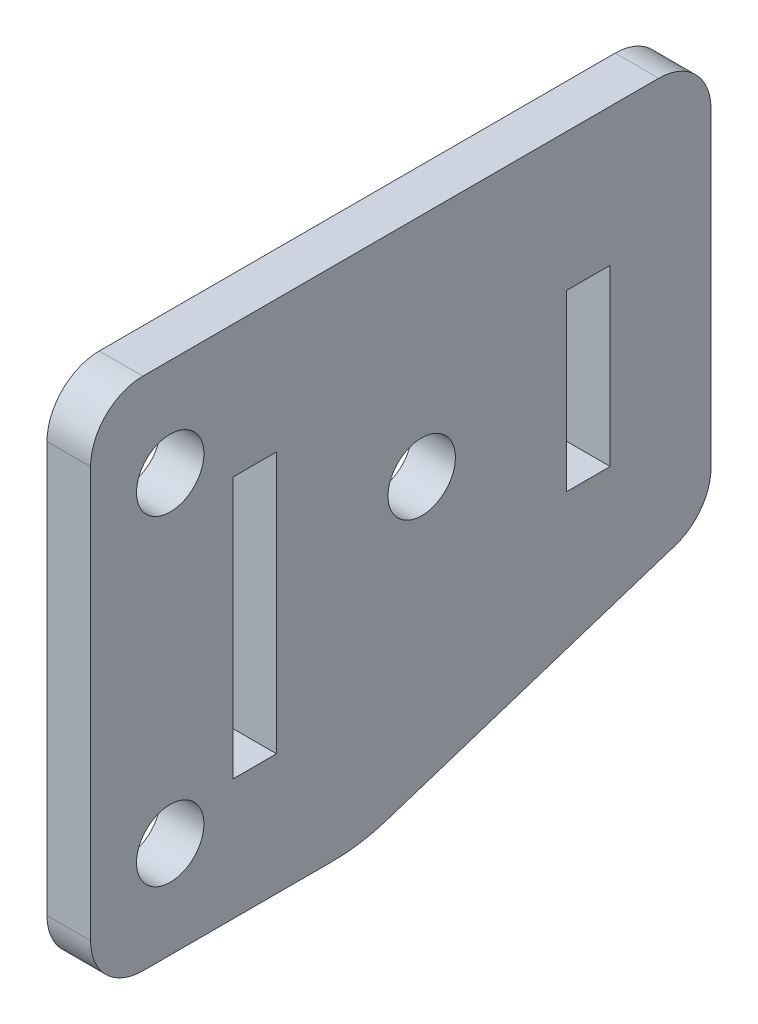
ISO-10303-21;
HEADER;
FILE_DESCRIPTION(('STEP AP214'),'2;1');
FILE_NAME('part.step','',(''),(''),'','','');
FILE_SCHEMA(('AUTOMOTIVE_DESIGN { 1 0 10303 214 1 1 1 1 }'));
ENDSEC;
DATA;
#1=APPLICATION_CONTEXT('core data for automotive mechanical design processes');
#2=APPLICATION_PROTOCOL_DEFINITION('international standard','automotive_design',2000,#1);
#3=PRODUCT_CONTEXT('',#1,'mechanical');
#4=PRODUCT('Part','Part','',(#3));
#5=PRODUCT_RELATED_PRODUCT_CATEGORY('part','',(#4));
#6=PRODUCT_DEFINITION_FORMATION('','',#4);
#7=PRODUCT_DEFINITION_CONTEXT('part definition',#1,'design');
#8=PRODUCT_DEFINITION('design','',#6,#7);
#9=PRODUCT_DEFINITION_SHAPE('','',#8);
#10=(LENGTH_UNIT() NAMED_UNIT(*) SI_UNIT(.MILLI.,.METRE.));
#11=(NAMED_UNIT(*) PLANE_ANGLE_UNIT() SI_UNIT($,.RADIAN.));
#12=(NAMED_UNIT(*) SI_UNIT($,.STERADIAN.) SOLID_ANGLE_UNIT());
#13=UNCERTAINTY_MEASURE_WITH_UNIT(LENGTH_MEASURE(1.E-05),#10,'distance_accuracy_value','');
#14=(GEOMETRIC_REPRESENTATION_CONTEXT(3) GLOBAL_UNCERTAINTY_ASSIGNED_CONTEXT((#13)) GLOBAL_UNIT_ASSIGNED_CONTEXT((#10,
#11,#12)) REPRESENTATION_CONTEXT('',''));
#15=CARTESIAN_POINT('',(0.,0.,0.));
#16=DIRECTION('',(0.,0.,1.));
#17=DIRECTION('',(1.,0.,0.));
#18=AXIS2_PLACEMENT_3D('',#15,#16,#17);
#19=CARTESIAN_POINT('',(-3.175,25.4,56.642));
#20=DIRECTION('',(0.,0.,1.));
#21=DIRECTION('',(1.,0.,0.));
#22=AXIS2_PLACEMENT_3D('',#19,#20,#21);
#23=PLANE('',#22);
#24=DIRECTION('',(0.,-1.,0.));
#25=VECTOR('',#24,1.);
#26=CARTESIAN_POINT('',(0.,25.4,56.642));
#27=LINE('',#26,#25);
#28=CARTESIAN_POINT('',(0.,21.59,56.642));
#29=VERTEX_POINT('',#28);
#30=CARTESIAN_POINT('',(0.,-8.32104000000001,56.642));
#31=VERTEX_POINT('',#30);
#32=EDGE_CURVE('E257',#29,#31,#27,.T.);
#33=ORIENTED_EDGE('',*,*,#32,.F.);
#34=DIRECTION('',(1.,0.,0.));
#35=VECTOR('',#34,1.);
#36=CARTESIAN_POINT('',(-3.175,21.59,56.642));
#37=LINE('',#36,#35);
#38=CARTESIAN_POINT('',(-3.175,21.59,56.642));
#39=VERTEX_POINT('',#38);
#40=EDGE_CURVE('E41',#29,#39,#37,.F.);
#41=ORIENTED_EDGE('',*,*,#40,.T.);
#42=DIRECTION('',(0.,-1.,0.));
#43=VECTOR('',#42,1.);
#44=CARTESIAN_POINT('',(-3.175,25.4,56.642));
#45=LINE('',#44,#43);
#46=CARTESIAN_POINT('',(-3.175,-8.32104000000001,56.642));
#47=VERTEX_POINT('',#46);
#48=EDGE_CURVE('E268',#39,#47,#45,.T.);
#49=ORIENTED_EDGE('',*,*,#48,.T.);
#50=DIRECTION('',(1.,0.,0.));
#51=VECTOR('',#50,1.);
#52=CARTESIAN_POINT('',(-3.175,-8.32104000000001,56.642));
#53=LINE('',#52,#51);
#54=EDGE_CURVE('E317',#47,#31,#53,.T.);
#55=ORIENTED_EDGE('',*,*,#54,.T.);
#56=EDGE_LOOP('',(#33,#41,#49,#55));
#57=FACE_BOUND('',#56,.T.);
#58=ADVANCED_FACE('F33',(#57),#23,.T.);
#59=CARTESIAN_POINT('',(-3.175,25.4,11.43));
#60=DIRECTION('',(0.,1.,0.));
#61=DIRECTION('',(0.,0.,1.));
#62=AXIS2_PLACEMENT_3D('',#59,#60,#61);
#63=PLANE('',#62);
#64=DIRECTION('',(0.,0.,1.));
#65=VECTOR('',#64,1.);
#66=CARTESIAN_POINT('',(0.,25.4,11.43));
#67=LINE('',#66,#65);
#68=CARTESIAN_POINT('',(0.,25.4,15.24));
#69=VERTEX_POINT('',#68);
#70=CARTESIAN_POINT('',(0.,25.4,52.832));
#71=VERTEX_POINT('',#70);
#72=EDGE_CURVE('E281',#69,#71,#67,.T.);
#73=ORIENTED_EDGE('',*,*,#72,.F.);
#74=DIRECTION('',(1.,0.,0.));
#75=VECTOR('',#74,1.);
#76=CARTESIAN_POINT('',(-3.175,25.4,15.24));
#77=LINE('',#76,#75);
#78=CARTESIAN_POINT('',(-3.175,25.4,15.24));
#79=VERTEX_POINT('',#78);
#80=EDGE_CURVE('E306',#69,#79,#77,.F.);
#81=ORIENTED_EDGE('',*,*,#80,.T.);
#82=DIRECTION('',(0.,0.,1.));
#83=VECTOR('',#82,1.);
#84=CARTESIAN_POINT('',(-3.175,25.4,11.43));
#85=LINE('',#84,#83);
#86=CARTESIAN_POINT('',(-3.175,25.4,52.832));
#87=VERTEX_POINT('',#86);
#88=EDGE_CURVE('E265',#79,#87,#85,.T.);
#89=ORIENTED_EDGE('',*,*,#88,.T.);
#90=DIRECTION('',(1.,0.,0.));
#91=VECTOR('',#90,1.);
#92=CARTESIAN_POINT('',(-3.175,25.4,52.832));
#93=LINE('',#92,#91);
#94=EDGE_CURVE('E303',#87,#71,#93,.T.);
#95=ORIENTED_EDGE('',*,*,#94,.T.);
#96=EDGE_LOOP('',(#73,#81,#89,#95));
#97=FACE_BOUND('',#96,.T.);
#98=ADVANCED_FACE('F331',(#97),#63,.T.);
#99=CARTESIAN_POINT('',(-3.175,-3.83383616291751,11.43));
#100=DIRECTION('',(0.,0.,-1.));
#101=DIRECTION('',(-1.,0.,0.));
#102=AXIS2_PLACEMENT_3D('',#99,#100,#101);
#103=PLANE('',#102);
#104=DIRECTION('',(0.,1.,0.));
#105=VECTOR('',#104,1.);
#106=CARTESIAN_POINT('',(-3.175,-3.83383616291751,11.43));
#107=LINE('',#106,#105);
#108=CARTESIAN_POINT('',(-3.175,-1.06497014433907,11.43));
#109=VERTEX_POINT('',#108);
#110=CARTESIAN_POINT('',(-3.175,21.59,11.43));
#111=VERTEX_POINT('',#110);
#112=EDGE_CURVE('E262',#109,#111,#107,.T.);
#113=ORIENTED_EDGE('',*,*,#112,.T.);
#114=DIRECTION('',(1.,0.,0.));
#115=VECTOR('',#114,1.);
#116=CARTESIAN_POINT('',(-3.175,21.59,11.43));
#117=LINE('',#116,#115);
#118=CARTESIAN_POINT('',(0.,21.59,11.43));
#119=VERTEX_POINT('',#118);
#120=EDGE_CURVE('E292',#111,#119,#117,.T.);
#121=ORIENTED_EDGE('',*,*,#120,.T.);
#122=DIRECTION('',(0.,1.,0.));
#123=VECTOR('',#122,1.);
#124=CARTESIAN_POINT('',(0.,-3.83383616291751,11.43));
#125=LINE('',#124,#123);
#126=CARTESIAN_POINT('',(0.,-1.06497014433907,11.43));
#127=VERTEX_POINT('',#126);
#128=EDGE_CURVE('E278',#127,#119,#125,.T.);
#129=ORIENTED_EDGE('',*,*,#128,.F.);
#130=DIRECTION('',(1.,0.,0.));
#131=VECTOR('',#130,1.);
#132=CARTESIAN_POINT('',(-3.175,-1.06497014433907,11.43));
#133=LINE('',#132,#131);
#134=EDGE_CURVE('E288',#127,#109,#133,.F.);
#135=ORIENTED_EDGE('',*,*,#134,.T.);
#136=EDGE_LOOP('',(#113,#121,#129,#135));
#137=FACE_BOUND('',#136,.T.);
#138=ADVANCED_FACE('F340',(#137),#103,.T.);
#139=CARTESIAN_POINT('',(-3.175,-11.5104536973722,35.0766243864602));
#140=DIRECTION('',(0.,-0.95113493680096,-0.308775536590309));
#141=DIRECTION('',(0.,0.308775536590309,-0.951134936800961));
#142=AXIS2_PLACEMENT_3D('',#139,#140,#141);
#143=PLANE('',#142);
#144=DIRECTION('',(0.,0.308775536590309,-0.95113493680096));
#145=VECTOR('',#144,1.);
#146=CARTESIAN_POINT('',(-3.175,-11.5104536973722,35.0766243864602));
#147=LINE('',#146,#145);
#148=CARTESIAN_POINT('',(-3.175,-11.5104536973722,35.0766243864602));
#149=VERTEX_POINT('',#148);
#150=CARTESIAN_POINT('',(-3.175,-4.68879425355073,14.0635652055909));
#151=VERTEX_POINT('',#150);
#152=EDGE_CURVE('E260',#149,#151,#147,.T.);
#153=ORIENTED_EDGE('',*,*,#152,.T.);
#154=DIRECTION('',(1.,0.,0.));
#155=VECTOR('',#154,1.);
#156=CARTESIAN_POINT('',(-3.175,-4.68879425355073,14.0635652055909));
#157=LINE('',#156,#155);
#158=CARTESIAN_POINT('',(0.,-4.68879425355073,14.0635652055909));
#159=VERTEX_POINT('',#158);
#160=EDGE_CURVE('E314',#151,#159,#157,.T.);
#161=ORIENTED_EDGE('',*,*,#160,.T.);
#162=DIRECTION('',(0.,0.308775536590309,-0.95113493680096));
#163=VECTOR('',#162,1.);
#164=CARTESIAN_POINT('',(0.,-11.5104536973722,35.0766243864602));
#165=LINE('',#164,#163);
#166=CARTESIAN_POINT('',(0.,-11.5104536973722,35.0766243864602));
#167=VERTEX_POINT('',#166);
#168=EDGE_CURVE('E275',#167,#159,#165,.T.);
#169=ORIENTED_EDGE('',*,*,#168,.F.);
#170=DIRECTION('',(1.,0.,0.));
#171=VECTOR('',#170,1.);
#172=CARTESIAN_POINT('',(-3.175,-11.5104536973722,35.0766243864602));
#173=LINE('',#172,#171);
#174=EDGE_CURVE('E286',#149,#167,#173,.T.);
#175=ORIENTED_EDGE('',*,*,#174,.F.);
#176=EDGE_LOOP('',(#153,#161,#169,#175));
#177=FACE_BOUND('',#176,.T.);
#178=ADVANCED_FACE('F347',(#177),#143,.T.);
#179=CARTESIAN_POINT('',(-3.175,0.56895999999998,38.9980737011571));
#180=DIRECTION('',(1.,0.,0.));
#181=DIRECTION('',(0.,0.,-1.));
#182=AXIS2_PLACEMENT_3D('',#179,#180,#181);
#183=CYLINDRICAL_SURFACE('',#182,12.7);
#184=CARTESIAN_POINT('',(0.,0.56895999999998,38.9980737011571));
#185=DIRECTION('',(1.,0.,0.));
#186=DIRECTION('',(0.,0.,-1.));
#187=AXIS2_PLACEMENT_3D('',#184,#185,#186);
#188=CIRCLE('',#187,12.7);
#189=CARTESIAN_POINT('',(0.,-12.13104,38.9980737011571));
#190=VERTEX_POINT('',#189);
#191=EDGE_CURVE('E272',#190,#167,#188,.T.);
#192=ORIENTED_EDGE('',*,*,#191,.F.);
#193=DIRECTION('',(1.,0.,0.));
#194=VECTOR('',#193,1.);
#195=CARTESIAN_POINT('',(-3.175,-12.13104,38.9980737011571));
#196=LINE('',#195,#194);
#197=CARTESIAN_POINT('',(-3.175,-12.13104,38.9980737011571));
#198=VERTEX_POINT('',#197);
#199=EDGE_CURVE('E270',#198,#190,#196,.T.);
#200=ORIENTED_EDGE('',*,*,#199,.F.);
#201=CARTESIAN_POINT('',(-3.175,0.56895999999998,38.9980737011571));
#202=DIRECTION('',(1.,0.,0.));
#203=DIRECTION('',(0.,0.,-1.));
#204=AXIS2_PLACEMENT_3D('',#201,#202,#203);
#205=CIRCLE('',#204,12.7);
#206=EDGE_CURVE('E256',#198,#149,#205,.T.);
#207=ORIENTED_EDGE('',*,*,#206,.T.);
#208=ORIENTED_EDGE('',*,*,#174,.T.);
#209=EDGE_LOOP('',(#192,#200,#207,#208));
#210=FACE_BOUND('',#209,.T.);
#211=ADVANCED_FACE('F352',(#210),#183,.T.);
#212=CARTESIAN_POINT('',(-3.175,-12.13104,38.9980737011571));
#213=DIRECTION('',(0.,-1.,0.));
#214=DIRECTION('',(0.,0.,-1.));
#215=AXIS2_PLACEMENT_3D('',#212,#213,#214);
#216=PLANE('',#215);
#217=DIRECTION('',(0.,0.,-1.));
#218=VECTOR('',#217,1.);
#219=CARTESIAN_POINT('',(0.,-12.13104,38.9980737011571));
#220=LINE('',#219,#218);
#221=CARTESIAN_POINT('',(0.,-12.13104,52.832));
#222=VERTEX_POINT('',#221);
#223=EDGE_CURVE('E253',#222,#190,#220,.T.);
#224=ORIENTED_EDGE('',*,*,#223,.F.);
#225=DIRECTION('',(1.,0.,0.));
#226=VECTOR('',#225,1.);
#227=CARTESIAN_POINT('',(-3.175,-12.13104,52.832));
#228=LINE('',#227,#226);
#229=CARTESIAN_POINT('',(-3.175,-12.13104,52.832));
#230=VERTEX_POINT('',#229);
#231=EDGE_CURVE('E11',#222,#230,#228,.F.);
#232=ORIENTED_EDGE('',*,*,#231,.T.);
#233=DIRECTION('',(0.,0.,-1.));
#234=VECTOR('',#233,1.);
#235=CARTESIAN_POINT('',(-3.175,-12.13104,39.2034693834696));
#236=LINE('',#235,#234);
#237=EDGE_CURVE('E254',#230,#198,#236,.T.);
#238=ORIENTED_EDGE('',*,*,#237,.T.);
#239=ORIENTED_EDGE('',*,*,#199,.T.);
#240=EDGE_LOOP('',(#224,#232,#238,#239));
#241=FACE_BOUND('',#240,.T.);
#242=ADVANCED_FACE('F357',(#241),#216,.T.);
#243=CARTESIAN_POINT('',(-3.175,0.56895999999998,38.9980737011571));
#244=DIRECTION('',(1.,0.,0.));
#245=DIRECTION('',(0.,0.,-1.));
#246=AXIS2_PLACEMENT_3D('',#243,#244,#245);
#247=PLANE('',#246);
#248=DIRECTION('',(0.,-1.,0.));
#249=VECTOR('',#248,1.);
#250=CARTESIAN_POINT('',(-3.175,-3.30200000000007,43.0911));
#251=LINE('',#250,#249);
#252=CARTESIAN_POINT('',(-3.175,15.7479999999999,43.0911));
#253=VERTEX_POINT('',#252);
#254=CARTESIAN_POINT('',(-3.175,-3.30200000000007,43.0911));
#255=VERTEX_POINT('',#254);
#256=EDGE_CURVE('E194',#253,#255,#251,.T.);
#257=ORIENTED_EDGE('',*,*,#256,.F.);
#258=DIRECTION('',(0.,0.,-1.));
#259=VECTOR('',#258,1.);
#260=CARTESIAN_POINT('',(-3.175,15.7479999999999,43.0911));
#261=LINE('',#260,#259);
#262=CARTESIAN_POINT('',(-3.175,15.7479999999999,46.2661));
#263=VERTEX_POINT('',#262);
#264=EDGE_CURVE('E167',#263,#253,#261,.T.);
#265=ORIENTED_EDGE('',*,*,#264,.F.);
#266=DIRECTION('',(0.,1.,0.));
#267=VECTOR('',#266,1.);
#268=CARTESIAN_POINT('',(-3.175,15.7479999999999,46.2661));
#269=LINE('',#268,#267);
#270=CARTESIAN_POINT('',(-3.175,-3.30200000000007,46.2661));
#271=VERTEX_POINT('',#270);
#272=EDGE_CURVE('E185',#271,#263,#269,.T.);
#273=ORIENTED_EDGE('',*,*,#272,.F.);
#274=DIRECTION('',(0.,0.,1.));
#275=VECTOR('',#274,1.);
#276=CARTESIAN_POINT('',(-3.175,-3.30200000000007,46.2661));
#277=LINE('',#276,#275);
#278=EDGE_CURVE('E188',#255,#271,#277,.T.);
#279=ORIENTED_EDGE('',*,*,#278,.F.);
#280=EDGE_LOOP('',(#257,#265,#273,#279));
#281=FACE_BOUND('',#280,.T.);
#282=DIRECTION('',(0.,0.,-1.));
#283=VECTOR('',#282,1.);
#284=CARTESIAN_POINT('',(-3.175,15.3709938714929,21.9521444970417));
#285=LINE('',#284,#283);
#286=CARTESIAN_POINT('',(-3.175,15.3709938714929,21.9521444970417));
#287=VERTEX_POINT('',#286);
#288=CARTESIAN_POINT('',(-3.175,15.3709938714929,18.7771444970417));
#289=VERTEX_POINT('',#288);
#290=EDGE_CURVE('E221',#287,#289,#285,.T.);
#291=ORIENTED_EDGE('',*,*,#290,.F.);
#292=DIRECTION('',(0.,1.,0.));
#293=VECTOR('',#292,1.);
#294=CARTESIAN_POINT('',(-3.175,2.67099387149287,21.9521444970417));
#295=LINE('',#294,#293);
#296=CARTESIAN_POINT('',(-3.175,2.67099387149287,21.9521444970417));
#297=VERTEX_POINT('',#296);
#298=EDGE_CURVE('E219',#297,#287,#295,.T.);
#299=ORIENTED_EDGE('',*,*,#298,.F.);
#300=DIRECTION('',(0.,0.,1.));
#301=VECTOR('',#300,1.);
#302=CARTESIAN_POINT('',(-3.175,2.67099387149287,18.7771444970417));
#303=LINE('',#302,#301);
#304=CARTESIAN_POINT('',(-3.175,2.67099387149287,18.7771444970417));
#305=VERTEX_POINT('',#304);
#306=EDGE_CURVE('E209',#305,#297,#303,.T.);
#307=ORIENTED_EDGE('',*,*,#306,.F.);
#308=DIRECTION('',(0.,-1.,0.));
#309=VECTOR('',#308,1.);
#310=CARTESIAN_POINT('',(-3.175,15.3709938714929,18.7771444970417));
#311=LINE('',#310,#309);
#312=EDGE_CURVE('E224',#289,#305,#311,.T.);
#313=ORIENTED_EDGE('',*,*,#312,.F.);
#314=EDGE_LOOP('',(#291,#299,#307,#313));
#315=FACE_BOUND('',#314,.T.);
#316=CARTESIAN_POINT('',(-3.175,-5.08,50.8381));
#317=DIRECTION('',(1.,0.,0.));
#318=DIRECTION('',(0.,0.,-1.));
#319=AXIS2_PLACEMENT_3D('',#316,#317,#318);
#320=CIRCLE('',#319,2.45744999999999);
#321=CARTESIAN_POINT('',(-3.175,-5.08,48.38065));
#322=VERTEX_POINT('',#321);
#323=EDGE_CURVE('E238',#322,#322,#320,.T.);
#324=ORIENTED_EDGE('',*,*,#323,.T.);
#325=EDGE_LOOP('',(#324));
#326=FACE_BOUND('',#325,.T.);
#327=CARTESIAN_POINT('',(-3.175,18.288,50.8381));
#328=DIRECTION('',(1.,0.,0.));
#329=DIRECTION('',(0.,0.,-1.));
#330=AXIS2_PLACEMENT_3D('',#327,#328,#329);
#331=CIRCLE('',#330,2.45744999999999);
#332=CARTESIAN_POINT('',(-3.175,18.288,48.38065));
#333=VERTEX_POINT('',#332);
#334=EDGE_CURVE('E244',#333,#333,#331,.T.);
#335=ORIENTED_EDGE('',*,*,#334,.T.);
#336=EDGE_LOOP('',(#335));
#337=FACE_BOUND('',#336,.T.);
#338=CARTESIAN_POINT('',(-3.175,8.89,32.5120000000061));
#339=DIRECTION('',(1.,0.,0.));
#340=DIRECTION('',(0.,0.,-1.));
#341=AXIS2_PLACEMENT_3D('',#338,#339,#340);
#342=CIRCLE('',#341,2.45744999999999);
#343=CARTESIAN_POINT('',(-3.175,8.89,30.0545500000061));
#344=VERTEX_POINT('',#343);
#345=EDGE_CURVE('E250',#344,#344,#342,.T.);
#346=ORIENTED_EDGE('',*,*,#345,.T.);
#347=EDGE_LOOP('',(#346));
#348=FACE_BOUND('',#347,.T.);
#349=ORIENTED_EDGE('',*,*,#88,.F.);
#350=CARTESIAN_POINT('',(-3.175,21.59,15.24));
#351=DIRECTION('',(1.,0.,0.));
#352=DIRECTION('',(0.,0.,-1.));
#353=AXIS2_PLACEMENT_3D('',#350,#351,#352);
#354=CIRCLE('',#353,3.81);
#355=EDGE_CURVE('E312',#79,#111,#354,.F.);
#356=ORIENTED_EDGE('',*,*,#355,.T.);
#357=ORIENTED_EDGE('',*,*,#112,.F.);
#358=CARTESIAN_POINT('',(-3.175,-1.06497014433907,15.24));
#359=DIRECTION('',(1.,0.,0.));
#360=DIRECTION('',(0.,0.,-1.));
#361=AXIS2_PLACEMENT_3D('',#358,#359,#360);
#362=CIRCLE('',#361,3.81);
#363=EDGE_CURVE('E48',#109,#151,#362,.F.);
#364=ORIENTED_EDGE('',*,*,#363,.T.);
#365=ORIENTED_EDGE('',*,*,#152,.F.);
#366=ORIENTED_EDGE('',*,*,#206,.F.);
#367=ORIENTED_EDGE('',*,*,#237,.F.);
#368=CARTESIAN_POINT('',(-3.175,-8.32104000000001,52.832));
#369=DIRECTION('',(1.,0.,0.));
#370=DIRECTION('',(0.,0.,-1.));
#371=AXIS2_PLACEMENT_3D('',#368,#369,#370);
#372=CIRCLE('',#371,3.81);
#373=EDGE_CURVE('E55',#230,#47,#372,.F.);
#374=ORIENTED_EDGE('',*,*,#373,.T.);
#375=ORIENTED_EDGE('',*,*,#48,.F.);
#376=CARTESIAN_POINT('',(-3.175,21.59,52.832));
#377=DIRECTION('',(1.,0.,0.));
#378=DIRECTION('',(0.,0.,-1.));
#379=AXIS2_PLACEMENT_3D('',#376,#377,#378);
#380=CIRCLE('',#379,3.81);
#381=EDGE_CURVE('E309',#39,#87,#380,.F.);
#382=ORIENTED_EDGE('',*,*,#381,.T.);
#383=EDGE_LOOP('',(#349,#356,#357,#364,#365,#366,#367,#374,#375,#382));
#384=FACE_BOUND('',#383,.T.);
#385=ADVANCED_FACE('F326',(#281,#315,#326,#337,#348,#384),#247,.F.);
#386=CARTESIAN_POINT('',(0.,0.56895999999998,38.9980737011571));
#387=DIRECTION('',(1.,0.,0.));
#388=DIRECTION('',(0.,0.,-1.));
#389=AXIS2_PLACEMENT_3D('',#386,#387,#388);
#390=PLANE('',#389);
#391=DIRECTION('',(0.,0.,-1.));
#392=VECTOR('',#391,1.);
#393=CARTESIAN_POINT('',(0.,15.7479999999999,43.0911));
#394=LINE('',#393,#392);
#395=CARTESIAN_POINT('',(0.,15.7479999999999,46.2661));
#396=VERTEX_POINT('',#395);
#397=CARTESIAN_POINT('',(0.,15.7479999999999,43.0911));
#398=VERTEX_POINT('',#397);
#399=EDGE_CURVE('E164',#396,#398,#394,.T.);
#400=ORIENTED_EDGE('',*,*,#399,.T.);
#401=DIRECTION('',(0.,-1.,0.));
#402=VECTOR('',#401,1.);
#403=CARTESIAN_POINT('',(0.,-3.30200000000007,43.0911));
#404=LINE('',#403,#402);
#405=CARTESIAN_POINT('',(0.,-3.30200000000007,43.0911));
#406=VERTEX_POINT('',#405);
#407=EDGE_CURVE('E176',#398,#406,#404,.T.);
#408=ORIENTED_EDGE('',*,*,#407,.T.);
#409=DIRECTION('',(0.,0.,1.));
#410=VECTOR('',#409,1.);
#411=CARTESIAN_POINT('',(0.,-3.30200000000007,46.2661));
#412=LINE('',#411,#410);
#413=CARTESIAN_POINT('',(0.,-3.30200000000007,46.2661));
#414=VERTEX_POINT('',#413);
#415=EDGE_CURVE('E180',#406,#414,#412,.T.);
#416=ORIENTED_EDGE('',*,*,#415,.T.);
#417=DIRECTION('',(0.,1.,0.));
#418=VECTOR('',#417,1.);
#419=CARTESIAN_POINT('',(0.,15.7479999999999,46.2661));
#420=LINE('',#419,#418);
#421=EDGE_CURVE('E172',#414,#396,#420,.T.);
#422=ORIENTED_EDGE('',*,*,#421,.T.);
#423=EDGE_LOOP('',(#400,#408,#416,#422));
#424=FACE_BOUND('',#423,.T.);
#425=DIRECTION('',(0.,1.,0.));
#426=VECTOR('',#425,1.);
#427=CARTESIAN_POINT('',(0.,2.67099387149287,21.9521444970417));
#428=LINE('',#427,#426);
#429=CARTESIAN_POINT('',(0.,2.67099387149287,21.9521444970417));
#430=VERTEX_POINT('',#429);
#431=CARTESIAN_POINT('',(0.,15.3709938714929,21.9521444970417));
#432=VERTEX_POINT('',#431);
#433=EDGE_CURVE('E205',#430,#432,#428,.T.);
#434=ORIENTED_EDGE('',*,*,#433,.T.);
#435=DIRECTION('',(0.,0.,-1.));
#436=VECTOR('',#435,1.);
#437=CARTESIAN_POINT('',(0.,15.3709938714929,21.9521444970417));
#438=LINE('',#437,#436);
#439=CARTESIAN_POINT('',(0.,15.3709938714929,18.7771444970417));
#440=VERTEX_POINT('',#439);
#441=EDGE_CURVE('E208',#432,#440,#438,.T.);
#442=ORIENTED_EDGE('',*,*,#441,.T.);
#443=DIRECTION('',(0.,-1.,0.));
#444=VECTOR('',#443,1.);
#445=CARTESIAN_POINT('',(0.,15.3709938714929,18.7771444970417));
#446=LINE('',#445,#444);
#447=CARTESIAN_POINT('',(0.,2.67099387149287,18.7771444970417));
#448=VERTEX_POINT('',#447);
#449=EDGE_CURVE('E212',#440,#448,#446,.T.);
#450=ORIENTED_EDGE('',*,*,#449,.T.);
#451=DIRECTION('',(0.,0.,1.));
#452=VECTOR('',#451,1.);
#453=CARTESIAN_POINT('',(0.,2.67099387149287,18.7771444970417));
#454=LINE('',#453,#452);
#455=EDGE_CURVE('E215',#448,#430,#454,.T.);
#456=ORIENTED_EDGE('',*,*,#455,.T.);
#457=EDGE_LOOP('',(#434,#442,#450,#456));
#458=FACE_BOUND('',#457,.T.);
#459=CARTESIAN_POINT('',(0.,-5.08,50.8381));
#460=DIRECTION('',(1.,0.,0.));
#461=DIRECTION('',(0.,0.,-1.));
#462=AXIS2_PLACEMENT_3D('',#459,#460,#461);
#463=CIRCLE('',#462,2.45744999999999);
#464=CARTESIAN_POINT('',(0.,-5.08,48.38065));
#465=VERTEX_POINT('',#464);
#466=EDGE_CURVE('E201',#465,#465,#463,.T.);
#467=ORIENTED_EDGE('',*,*,#466,.F.);
#468=EDGE_LOOP('',(#467));
#469=FACE_BOUND('',#468,.T.);
#470=CARTESIAN_POINT('',(0.,18.288,50.8381));
#471=DIRECTION('',(1.,0.,0.));
#472=DIRECTION('',(0.,0.,-1.));
#473=AXIS2_PLACEMENT_3D('',#470,#471,#472);
#474=CIRCLE('',#473,2.45744999999999);
#475=CARTESIAN_POINT('',(0.,18.288,48.38065));
#476=VERTEX_POINT('',#475);
#477=EDGE_CURVE('E241',#476,#476,#474,.T.);
#478=ORIENTED_EDGE('',*,*,#477,.F.);
#479=EDGE_LOOP('',(#478));
#480=FACE_BOUND('',#479,.T.);
#481=CARTESIAN_POINT('',(0.,8.89,32.5120000000061));
#482=DIRECTION('',(1.,0.,0.));
#483=DIRECTION('',(0.,0.,-1.));
#484=AXIS2_PLACEMENT_3D('',#481,#482,#483);
#485=CIRCLE('',#484,2.45744999999999);
#486=CARTESIAN_POINT('',(0.,8.89,30.0545500000061));
#487=VERTEX_POINT('',#486);
#488=EDGE_CURVE('E247',#487,#487,#485,.T.);
#489=ORIENTED_EDGE('',*,*,#488,.F.);
#490=EDGE_LOOP('',(#489));
#491=FACE_BOUND('',#490,.T.);
#492=ORIENTED_EDGE('',*,*,#128,.T.);
#493=CARTESIAN_POINT('',(0.,21.59,15.24));
#494=DIRECTION('',(1.,0.,0.));
#495=DIRECTION('',(0.,0.,-1.));
#496=AXIS2_PLACEMENT_3D('',#493,#494,#495);
#497=CIRCLE('',#496,3.81);
#498=EDGE_CURVE('E301',#119,#69,#497,.T.);
#499=ORIENTED_EDGE('',*,*,#498,.T.);
#500=ORIENTED_EDGE('',*,*,#72,.T.);
#501=CARTESIAN_POINT('',(0.,21.59,52.832));
#502=DIRECTION('',(1.,0.,0.));
#503=DIRECTION('',(0.,0.,-1.));
#504=AXIS2_PLACEMENT_3D('',#501,#502,#503);
#505=CIRCLE('',#504,3.81);
#506=EDGE_CURVE('E297',#71,#29,#505,.T.);
#507=ORIENTED_EDGE('',*,*,#506,.T.);
#508=ORIENTED_EDGE('',*,*,#32,.T.);
#509=CARTESIAN_POINT('',(0.,-8.32104000000001,52.832));
#510=DIRECTION('',(1.,0.,0.));
#511=DIRECTION('',(0.,0.,-1.));
#512=AXIS2_PLACEMENT_3D('',#509,#510,#511);
#513=CIRCLE('',#512,3.81);
#514=EDGE_CURVE('E295',#31,#222,#513,.T.);
#515=ORIENTED_EDGE('',*,*,#514,.T.);
#516=ORIENTED_EDGE('',*,*,#223,.T.);
#517=ORIENTED_EDGE('',*,*,#191,.T.);
#518=ORIENTED_EDGE('',*,*,#168,.T.);
#519=CARTESIAN_POINT('',(0.,-1.06497014433907,15.24));
#520=DIRECTION('',(1.,0.,0.));
#521=DIRECTION('',(0.,0.,-1.));
#522=AXIS2_PLACEMENT_3D('',#519,#520,#521);
#523=CIRCLE('',#522,3.81);
#524=EDGE_CURVE('E299',#159,#127,#523,.T.);
#525=ORIENTED_EDGE('',*,*,#524,.T.);
#526=EDGE_LOOP('',(#492,#499,#500,#507,#508,#515,#516,#517,#518,#525));
#527=FACE_BOUND('',#526,.T.);
#528=ADVANCED_FACE('F182',(#424,#458,#469,#480,#491,#527),#390,.T.);
#529=CARTESIAN_POINT('',(0.,8.89,32.5120000000061));
#530=DIRECTION('',(1.,0.,0.));
#531=DIRECTION('',(0.,0.,-1.));
#532=AXIS2_PLACEMENT_3D('',#529,#530,#531);
#533=CYLINDRICAL_SURFACE('',#532,2.45744999999999);
#534=ORIENTED_EDGE('',*,*,#488,.T.);
#535=EDGE_LOOP('',(#534));
#536=FACE_BOUND('',#535,.T.);
#537=ORIENTED_EDGE('',*,*,#345,.F.);
#538=EDGE_LOOP('',(#537));
#539=FACE_BOUND('',#538,.T.);
#540=ADVANCED_FACE('F393',(#536,#539),#533,.F.);
#541=CARTESIAN_POINT('',(0.,18.288,50.8381));
#542=DIRECTION('',(1.,0.,0.));
#543=DIRECTION('',(0.,0.,-1.));
#544=AXIS2_PLACEMENT_3D('',#541,#542,#543);
#545=CYLINDRICAL_SURFACE('',#544,2.45744999999999);
#546=ORIENTED_EDGE('',*,*,#477,.T.);
#547=EDGE_LOOP('',(#546));
#548=FACE_BOUND('',#547,.T.);
#549=ORIENTED_EDGE('',*,*,#334,.F.);
#550=EDGE_LOOP('',(#549));
#551=FACE_BOUND('',#550,.T.);
#552=ADVANCED_FACE('F398',(#548,#551),#545,.F.);
#553=CARTESIAN_POINT('',(0.,-5.08,50.8381));
#554=DIRECTION('',(1.,0.,0.));
#555=DIRECTION('',(0.,0.,-1.));
#556=AXIS2_PLACEMENT_3D('',#553,#554,#555);
#557=CYLINDRICAL_SURFACE('',#556,2.45744999999999);
#558=ORIENTED_EDGE('',*,*,#466,.T.);
#559=EDGE_LOOP('',(#558));
#560=FACE_BOUND('',#559,.T.);
#561=ORIENTED_EDGE('',*,*,#323,.F.);
#562=EDGE_LOOP('',(#561));
#563=FACE_BOUND('',#562,.T.);
#564=ADVANCED_FACE('F410',(#560,#563),#557,.F.);
#565=CARTESIAN_POINT('',(0.,2.67099387149287,21.9521444970417));
#566=DIRECTION('',(0.,0.,1.));
#567=DIRECTION('',(1.,0.,0.));
#568=AXIS2_PLACEMENT_3D('',#565,#566,#567);
#569=PLANE('',#568);
#570=ORIENTED_EDGE('',*,*,#298,.T.);
#571=DIRECTION('',(-1.,0.,0.));
#572=VECTOR('',#571,1.);
#573=CARTESIAN_POINT('',(0.,15.3709938714929,21.9521444970417));
#574=LINE('',#573,#572);
#575=EDGE_CURVE('E218',#432,#287,#574,.T.);
#576=ORIENTED_EDGE('',*,*,#575,.F.);
#577=ORIENTED_EDGE('',*,*,#433,.F.);
#578=DIRECTION('',(-1.,0.,0.));
#579=VECTOR('',#578,1.);
#580=CARTESIAN_POINT('',(0.,2.67099387149287,21.9521444970417));
#581=LINE('',#580,#579);
#582=EDGE_CURVE('E195',#430,#297,#581,.T.);
#583=ORIENTED_EDGE('',*,*,#582,.T.);
#584=EDGE_LOOP('',(#570,#576,#577,#583));
#585=FACE_BOUND('',#584,.T.);
#586=ADVANCED_FACE('F420',(#585),#569,.F.);
#587=CARTESIAN_POINT('',(0.,2.67099387149287,18.7771444970417));
#588=DIRECTION('',(0.,-1.,0.));
#589=DIRECTION('',(0.,0.,-1.));
#590=AXIS2_PLACEMENT_3D('',#587,#588,#589);
#591=PLANE('',#590);
#592=ORIENTED_EDGE('',*,*,#306,.T.);
#593=ORIENTED_EDGE('',*,*,#582,.F.);
#594=ORIENTED_EDGE('',*,*,#455,.F.);
#595=DIRECTION('',(-1.,0.,0.));
#596=VECTOR('',#595,1.);
#597=CARTESIAN_POINT('',(0.,2.67099387149287,18.7771444970417));
#598=LINE('',#597,#596);
#599=EDGE_CURVE('E230',#448,#305,#598,.T.);
#600=ORIENTED_EDGE('',*,*,#599,.T.);
#601=EDGE_LOOP('',(#592,#593,#594,#600));
#602=FACE_BOUND('',#601,.T.);
#603=ADVANCED_FACE('F430',(#602),#591,.F.);
#604=CARTESIAN_POINT('',(0.,15.3709938714929,18.7771444970417));
#605=DIRECTION('',(0.,0.,-1.));
#606=DIRECTION('',(-1.,0.,0.));
#607=AXIS2_PLACEMENT_3D('',#604,#605,#606);
#608=PLANE('',#607);
#609=ORIENTED_EDGE('',*,*,#312,.T.);
#610=ORIENTED_EDGE('',*,*,#599,.F.);
#611=ORIENTED_EDGE('',*,*,#449,.F.);
#612=DIRECTION('',(-1.,0.,0.));
#613=VECTOR('',#612,1.);
#614=CARTESIAN_POINT('',(0.,15.3709938714929,18.7771444970417));
#615=LINE('',#614,#613);
#616=EDGE_CURVE('E232',#440,#289,#615,.T.);
#617=ORIENTED_EDGE('',*,*,#616,.T.);
#618=EDGE_LOOP('',(#609,#610,#611,#617));
#619=FACE_BOUND('',#618,.T.);
#620=ADVANCED_FACE('F440',(#619),#608,.F.);
#621=CARTESIAN_POINT('',(0.,15.3709938714929,21.9521444970417));
#622=DIRECTION('',(0.,1.,0.));
#623=DIRECTION('',(0.,0.,1.));
#624=AXIS2_PLACEMENT_3D('',#621,#622,#623);
#625=PLANE('',#624);
#626=ORIENTED_EDGE('',*,*,#290,.T.);
#627=ORIENTED_EDGE('',*,*,#616,.F.);
#628=ORIENTED_EDGE('',*,*,#441,.F.);
#629=ORIENTED_EDGE('',*,*,#575,.T.);
#630=EDGE_LOOP('',(#626,#627,#628,#629));
#631=FACE_BOUND('',#630,.T.);
#632=ADVANCED_FACE('F450',(#631),#625,.F.);
#633=CARTESIAN_POINT('',(0.,15.7479999999999,43.0911));
#634=DIRECTION('',(0.,1.,0.));
#635=DIRECTION('',(0.,0.,1.));
#636=AXIS2_PLACEMENT_3D('',#633,#634,#635);
#637=PLANE('',#636);
#638=ORIENTED_EDGE('',*,*,#264,.T.);
#639=DIRECTION('',(-1.,0.,0.));
#640=VECTOR('',#639,1.);
#641=CARTESIAN_POINT('',(0.,15.7479999999999,43.0911));
#642=LINE('',#641,#640);
#643=EDGE_CURVE('E160',#398,#253,#642,.T.);
#644=ORIENTED_EDGE('',*,*,#643,.F.);
#645=ORIENTED_EDGE('',*,*,#399,.F.);
#646=DIRECTION('',(-1.,0.,0.));
#647=VECTOR('',#646,1.);
#648=CARTESIAN_POINT('',(0.,15.7479999999999,46.2661));
#649=LINE('',#648,#647);
#650=EDGE_CURVE('E199',#396,#263,#649,.T.);
#651=ORIENTED_EDGE('',*,*,#650,.T.);
#652=EDGE_LOOP('',(#638,#644,#645,#651));
#653=FACE_BOUND('',#652,.T.);
#654=ADVANCED_FACE('F162',(#653),#637,.F.);
#655=CARTESIAN_POINT('',(0.,15.7479999999999,46.2661));
#656=DIRECTION('',(0.,0.,1.));
#657=DIRECTION('',(0.,-1.,0.));
#658=AXIS2_PLACEMENT_3D('',#655,#656,#657);
#659=PLANE('',#658);
#660=ORIENTED_EDGE('',*,*,#272,.T.);
#661=ORIENTED_EDGE('',*,*,#650,.F.);
#662=ORIENTED_EDGE('',*,*,#421,.F.);
#663=DIRECTION('',(-1.,0.,0.));
#664=VECTOR('',#663,1.);
#665=CARTESIAN_POINT('',(0.,-3.30200000000007,46.2661));
#666=LINE('',#665,#664);
#667=EDGE_CURVE('E202',#414,#271,#666,.T.);
#668=ORIENTED_EDGE('',*,*,#667,.T.);
#669=EDGE_LOOP('',(#660,#661,#662,#668));
#670=FACE_BOUND('',#669,.T.);
#671=ADVANCED_FACE('F469',(#670),#659,.F.);
#672=CARTESIAN_POINT('',(0.,-3.30200000000007,46.2661));
#673=DIRECTION('',(0.,-1.,0.));
#674=DIRECTION('',(0.,0.,-1.));
#675=AXIS2_PLACEMENT_3D('',#672,#673,#674);
#676=PLANE('',#675);
#677=ORIENTED_EDGE('',*,*,#278,.T.);
#678=ORIENTED_EDGE('',*,*,#667,.F.);
#679=ORIENTED_EDGE('',*,*,#415,.F.);
#680=DIRECTION('',(-1.,0.,0.));
#681=VECTOR('',#680,1.);
#682=CARTESIAN_POINT('',(0.,-3.30200000000007,43.0911));
#683=LINE('',#682,#681);
#684=EDGE_CURVE('E171',#406,#255,#683,.T.);
#685=ORIENTED_EDGE('',*,*,#684,.T.);
#686=EDGE_LOOP('',(#677,#678,#679,#685));
#687=FACE_BOUND('',#686,.T.);
#688=ADVANCED_FACE('F478',(#687),#676,.F.);
#689=CARTESIAN_POINT('',(0.,-3.30200000000007,43.0911));
#690=DIRECTION('',(0.,0.,-1.));
#691=DIRECTION('',(-1.,0.,0.));
#692=AXIS2_PLACEMENT_3D('',#689,#690,#691);
#693=PLANE('',#692);
#694=ORIENTED_EDGE('',*,*,#256,.T.);
#695=ORIENTED_EDGE('',*,*,#684,.F.);
#696=ORIENTED_EDGE('',*,*,#407,.F.);
#697=ORIENTED_EDGE('',*,*,#643,.T.);
#698=EDGE_LOOP('',(#694,#695,#696,#697));
#699=FACE_BOUND('',#698,.T.);
#700=ADVANCED_FACE('F177',(#699),#693,.F.);
#701=CARTESIAN_POINT('',(-3.175,21.59,15.24));
#702=DIRECTION('',(1.,0.,0.));
#703=DIRECTION('',(0.,0.,-1.));
#704=AXIS2_PLACEMENT_3D('',#701,#702,#703);
#705=CYLINDRICAL_SURFACE('',#704,3.81);
#706=ORIENTED_EDGE('',*,*,#355,.F.);
#707=ORIENTED_EDGE('',*,*,#80,.F.);
#708=ORIENTED_EDGE('',*,*,#498,.F.);
#709=ORIENTED_EDGE('',*,*,#120,.F.);
#710=EDGE_LOOP('',(#706,#707,#708,#709));
#711=FACE_BOUND('',#710,.T.);
#712=ADVANCED_FACE('F338',(#711),#705,.T.);
#713=CARTESIAN_POINT('',(-3.175,-1.06497014433907,15.24));
#714=DIRECTION('',(1.,0.,0.));
#715=DIRECTION('',(0.,0.,-1.));
#716=AXIS2_PLACEMENT_3D('',#713,#714,#715);
#717=CYLINDRICAL_SURFACE('',#716,3.81);
#718=ORIENTED_EDGE('',*,*,#363,.F.);
#719=ORIENTED_EDGE('',*,*,#134,.F.);
#720=ORIENTED_EDGE('',*,*,#524,.F.);
#721=ORIENTED_EDGE('',*,*,#160,.F.);
#722=EDGE_LOOP('',(#718,#719,#720,#721));
#723=FACE_BOUND('',#722,.T.);
#724=ADVANCED_FACE('F344',(#723),#717,.T.);
#725=CARTESIAN_POINT('',(-3.175,21.59,52.832));
#726=DIRECTION('',(1.,0.,0.));
#727=DIRECTION('',(0.,0.,-1.));
#728=AXIS2_PLACEMENT_3D('',#725,#726,#727);
#729=CYLINDRICAL_SURFACE('',#728,3.81);
#730=ORIENTED_EDGE('',*,*,#381,.F.);
#731=ORIENTED_EDGE('',*,*,#40,.F.);
#732=ORIENTED_EDGE('',*,*,#506,.F.);
#733=ORIENTED_EDGE('',*,*,#94,.F.);
#734=EDGE_LOOP('',(#730,#731,#732,#733));
#735=FACE_BOUND('',#734,.T.);
#736=ADVANCED_FACE('F328',(#735),#729,.T.);
#737=CARTESIAN_POINT('',(-3.175,-8.32104000000001,52.832));
#738=DIRECTION('',(1.,0.,0.));
#739=DIRECTION('',(0.,0.,-1.));
#740=AXIS2_PLACEMENT_3D('',#737,#738,#739);
#741=CYLINDRICAL_SURFACE('',#740,3.81);
#742=ORIENTED_EDGE('',*,*,#373,.F.);
#743=ORIENTED_EDGE('',*,*,#231,.F.);
#744=ORIENTED_EDGE('',*,*,#514,.F.);
#745=ORIENTED_EDGE('',*,*,#54,.F.);
#746=EDGE_LOOP('',(#742,#743,#744,#745));
#747=FACE_BOUND('',#746,.T.);
#748=ADVANCED_FACE('F35',(#747),#741,.T.);
#749=CLOSED_SHELL('',(#58,#98,#138,#178,#211,#242,#385,#528,#540,#552,#564,#586,#603,#620,#632,
#654,#671,#688,#700,#712,#724,#736,#748));
#750=MANIFOLD_SOLID_BREP('B2',#749);
#751=ADVANCED_BREP_SHAPE_REPRESENTATION('',(#18,#750),#14);
#752=SHAPE_DEFINITION_REPRESENTATION(#9,#751);
ENDSEC;
END-ISO-10303-21;
